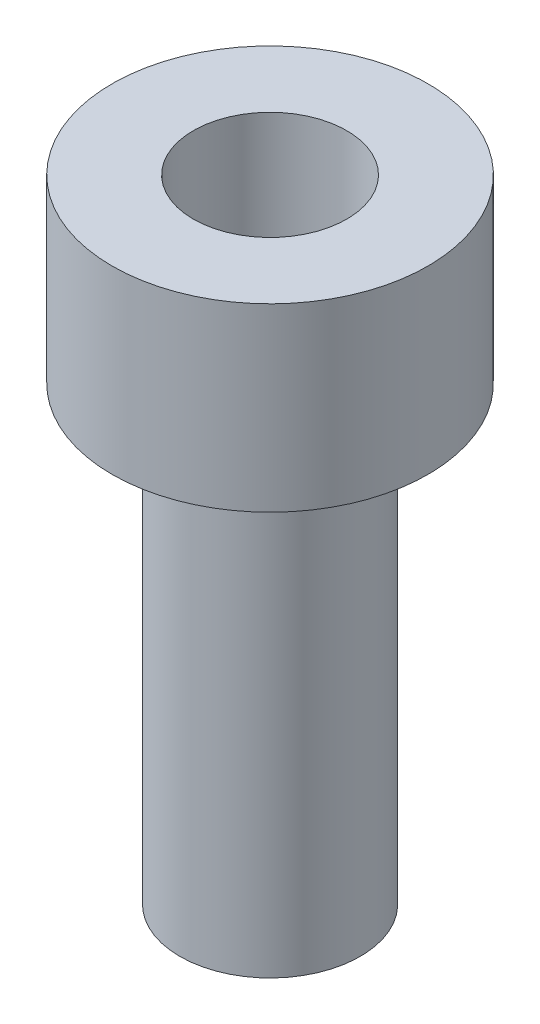
ISO-10303-21;
HEADER;
FILE_DESCRIPTION(('STEP AP214'),'2;1');
FILE_NAME('part.step','',(''),(''),'','','');
FILE_SCHEMA(('AUTOMOTIVE_DESIGN { 1 0 10303 214 1 1 1 1 }'));
ENDSEC;
DATA;
#1=APPLICATION_CONTEXT('core data for automotive mechanical design processes');
#2=APPLICATION_PROTOCOL_DEFINITION('international standard','automotive_design',2000,#1);
#3=PRODUCT_CONTEXT('',#1,'mechanical');
#4=PRODUCT('Part','Part','',(#3));
#5=PRODUCT_RELATED_PRODUCT_CATEGORY('part','',(#4));
#6=PRODUCT_DEFINITION_FORMATION('','',#4);
#7=PRODUCT_DEFINITION_CONTEXT('part definition',#1,'design');
#8=PRODUCT_DEFINITION('design','',#6,#7);
#9=PRODUCT_DEFINITION_SHAPE('','',#8);
#10=(LENGTH_UNIT() NAMED_UNIT(*) SI_UNIT(.MILLI.,.METRE.));
#11=(NAMED_UNIT(*) PLANE_ANGLE_UNIT() SI_UNIT($,.RADIAN.));
#12=(NAMED_UNIT(*) SI_UNIT($,.STERADIAN.) SOLID_ANGLE_UNIT());
#13=UNCERTAINTY_MEASURE_WITH_UNIT(LENGTH_MEASURE(1.E-05),#10,'distance_accuracy_value','');
#14=(GEOMETRIC_REPRESENTATION_CONTEXT(3) GLOBAL_UNCERTAINTY_ASSIGNED_CONTEXT((#13)) GLOBAL_UNIT_ASSIGNED_CONTEXT((#10,
#11,#12)) REPRESENTATION_CONTEXT('',''));
#15=CARTESIAN_POINT('',(0.,0.,0.));
#16=DIRECTION('',(0.,0.,1.));
#17=DIRECTION('',(1.,0.,0.));
#18=AXIS2_PLACEMENT_3D('',#15,#16,#17);
#19=CARTESIAN_POINT('',(0.,4.,0.));
#20=DIRECTION('',(0.,-1.,0.));
#21=DIRECTION('',(0.,0.,-1.));
#22=AXIS2_PLACEMENT_3D('',#19,#20,#21);
#23=CYLINDRICAL_SURFACE('',#22,3.5);
#24=CARTESIAN_POINT('',(0.,4.,0.));
#25=DIRECTION('',(0.,1.,0.));
#26=DIRECTION('',(0.,0.,1.));
#27=AXIS2_PLACEMENT_3D('',#24,#25,#26);
#28=CIRCLE('',#27,3.5);
#29=CARTESIAN_POINT('',(0.,4.,3.5));
#30=VERTEX_POINT('',#29);
#31=EDGE_CURVE('E10',#30,#30,#28,.T.);
#32=ORIENTED_EDGE('',*,*,#31,.F.);
#33=EDGE_LOOP('',(#32));
#34=FACE_BOUND('',#33,.T.);
#35=CARTESIAN_POINT('',(0.,0.,0.));
#36=DIRECTION('',(0.,1.,0.));
#37=DIRECTION('',(0.,0.,1.));
#38=AXIS2_PLACEMENT_3D('',#35,#36,#37);
#39=CIRCLE('',#38,3.5);
#40=CARTESIAN_POINT('',(0.,0.,3.5));
#41=VERTEX_POINT('',#40);
#42=EDGE_CURVE('E42',#41,#41,#39,.T.);
#43=ORIENTED_EDGE('',*,*,#42,.T.);
#44=EDGE_LOOP('',(#43));
#45=FACE_BOUND('',#44,.T.);
#46=ADVANCED_FACE('F41',(#34,#45),#23,.T.);
#47=CARTESIAN_POINT('',(0.,4.,0.));
#48=DIRECTION('',(0.,1.,0.));
#49=DIRECTION('',(0.,0.,1.));
#50=AXIS2_PLACEMENT_3D('',#47,#48,#49);
#51=PLANE('',#50);
#52=CARTESIAN_POINT('',(0.,4.,0.));
#53=DIRECTION('',(0.,1.,0.));
#54=DIRECTION('',(0.,0.,1.));
#55=AXIS2_PLACEMENT_3D('',#52,#53,#54);
#56=CIRCLE('',#55,1.7);
#57=CARTESIAN_POINT('',(0.,4.,1.7));
#58=VERTEX_POINT('',#57);
#59=EDGE_CURVE('E56',#58,#58,#56,.T.);
#60=ORIENTED_EDGE('',*,*,#59,.F.);
#61=EDGE_LOOP('',(#60));
#62=FACE_BOUND('',#61,.T.);
#63=ORIENTED_EDGE('',*,*,#31,.T.);
#64=EDGE_LOOP('',(#63));
#65=FACE_BOUND('',#64,.T.);
#66=ADVANCED_FACE('F74',(#62,#65),#51,.T.);
#67=CARTESIAN_POINT('',(0.,0.,0.));
#68=DIRECTION('',(0.,1.,0.));
#69=DIRECTION('',(0.,0.,1.));
#70=AXIS2_PLACEMENT_3D('',#67,#68,#69);
#71=PLANE('',#70);
#72=CARTESIAN_POINT('',(0.,0.,0.));
#73=DIRECTION('',(0.,1.,0.));
#74=DIRECTION('',(0.,0.,1.));
#75=AXIS2_PLACEMENT_3D('',#72,#73,#74);
#76=CIRCLE('',#75,2.);
#77=CARTESIAN_POINT('',(0.,0.,2.));
#78=VERTEX_POINT('',#77);
#79=EDGE_CURVE('E51',#78,#78,#76,.T.);
#80=ORIENTED_EDGE('',*,*,#79,.T.);
#81=EDGE_LOOP('',(#80));
#82=FACE_BOUND('',#81,.T.);
#83=ORIENTED_EDGE('',*,*,#42,.F.);
#84=EDGE_LOOP('',(#83));
#85=FACE_BOUND('',#84,.T.);
#86=ADVANCED_FACE('F78',(#82,#85),#71,.F.);
#87=CARTESIAN_POINT('',(0.,0.,0.));
#88=DIRECTION('',(0.,-1.,0.));
#89=DIRECTION('',(0.,0.,-1.));
#90=AXIS2_PLACEMENT_3D('',#87,#88,#89);
#91=CYLINDRICAL_SURFACE('',#90,2.);
#92=ORIENTED_EDGE('',*,*,#79,.F.);
#93=EDGE_LOOP('',(#92));
#94=FACE_BOUND('',#93,.T.);
#95=CARTESIAN_POINT('',(0.,-10.,0.));
#96=DIRECTION('',(0.,1.,0.));
#97=DIRECTION('',(0.,0.,1.));
#98=AXIS2_PLACEMENT_3D('',#95,#96,#97);
#99=CIRCLE('',#98,2.);
#100=CARTESIAN_POINT('',(0.,-10.,2.));
#101=VERTEX_POINT('',#100);
#102=EDGE_CURVE('E52',#101,#101,#99,.T.);
#103=ORIENTED_EDGE('',*,*,#102,.T.);
#104=EDGE_LOOP('',(#103));
#105=FACE_BOUND('',#104,.T.);
#106=ADVANCED_FACE('F85',(#94,#105),#91,.T.);
#107=CARTESIAN_POINT('',(0.,-10.,0.));
#108=DIRECTION('',(0.,1.,0.));
#109=DIRECTION('',(0.,0.,1.));
#110=AXIS2_PLACEMENT_3D('',#107,#108,#109);
#111=PLANE('',#110);
#112=ORIENTED_EDGE('',*,*,#102,.F.);
#113=EDGE_LOOP('',(#112));
#114=FACE_BOUND('',#113,.T.);
#115=ADVANCED_FACE('F66',(#114),#111,.F.);
#116=CARTESIAN_POINT('',(0.,1.6,0.));
#117=DIRECTION('',(0.,1.,0.));
#118=DIRECTION('',(0.,0.,1.));
#119=AXIS2_PLACEMENT_3D('',#116,#117,#118);
#120=CYLINDRICAL_SURFACE('',#119,1.7);
#121=CARTESIAN_POINT('',(0.,1.6,0.));
#122=DIRECTION('',(0.,1.,0.));
#123=DIRECTION('',(0.,0.,1.));
#124=AXIS2_PLACEMENT_3D('',#121,#122,#123);
#125=CIRCLE('',#124,1.7);
#126=CARTESIAN_POINT('',(0.,1.6,1.7));
#127=VERTEX_POINT('',#126);
#128=EDGE_CURVE('E57',#127,#127,#125,.T.);
#129=ORIENTED_EDGE('',*,*,#128,.F.);
#130=EDGE_LOOP('',(#129));
#131=FACE_BOUND('',#130,.T.);
#132=ORIENTED_EDGE('',*,*,#59,.T.);
#133=EDGE_LOOP('',(#132));
#134=FACE_BOUND('',#133,.T.);
#135=ADVANCED_FACE('F70',(#131,#134),#120,.F.);
#136=CARTESIAN_POINT('',(0.,1.6,0.));
#137=DIRECTION('',(0.,1.,0.));
#138=DIRECTION('',(0.,0.,1.));
#139=AXIS2_PLACEMENT_3D('',#136,#137,#138);
#140=PLANE('',#139);
#141=ORIENTED_EDGE('',*,*,#128,.T.);
#142=EDGE_LOOP('',(#141));
#143=FACE_BOUND('',#142,.T.);
#144=ADVANCED_FACE('F62',(#143),#140,.T.);
#145=CLOSED_SHELL('',(#46,#66,#86,#106,#115,#135,#144));
#146=MANIFOLD_SOLID_BREP('B2',#145);
#147=ADVANCED_BREP_SHAPE_REPRESENTATION('',(#18,#146),#14);
#148=SHAPE_DEFINITION_REPRESENTATION(#9,#147);
ENDSEC;
END-ISO-10303-21;
